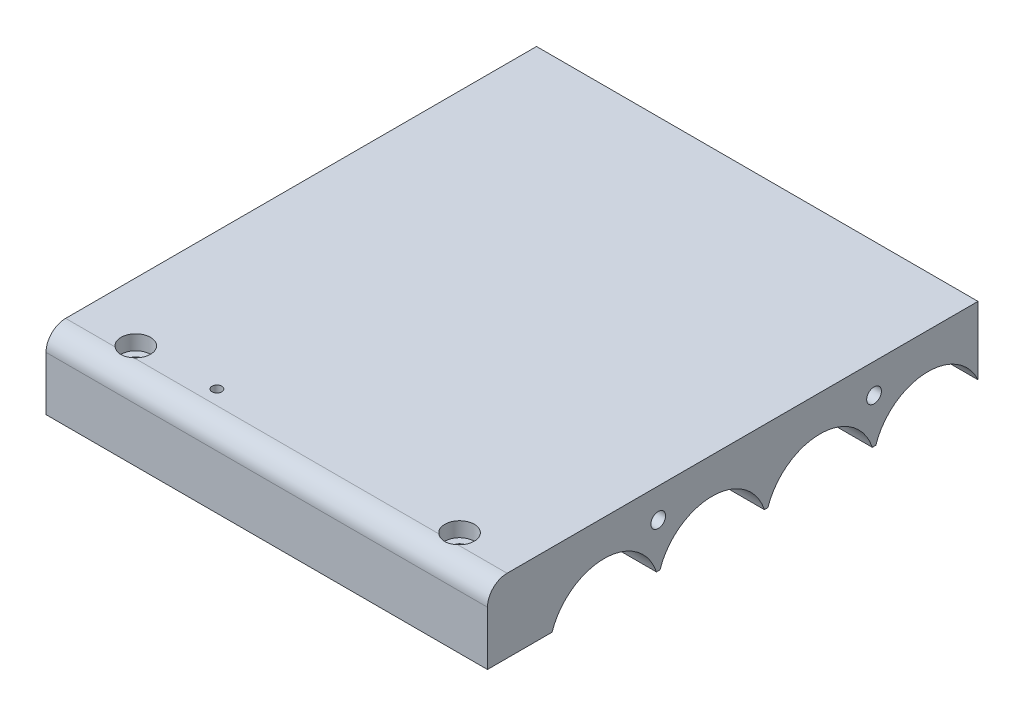
ISO-10303-21;
HEADER;
FILE_DESCRIPTION(('STEP AP214'),'2;1');
FILE_NAME('part.step','',(''),(''),'','','');
FILE_SCHEMA(('AUTOMOTIVE_DESIGN { 1 0 10303 214 1 1 1 1 }'));
ENDSEC;
DATA;
#1=APPLICATION_CONTEXT('core data for automotive mechanical design processes');
#2=APPLICATION_PROTOCOL_DEFINITION('international standard','automotive_design',2000,#1);
#3=PRODUCT_CONTEXT('',#1,'mechanical');
#4=PRODUCT('Part','Part','',(#3));
#5=PRODUCT_RELATED_PRODUCT_CATEGORY('part','',(#4));
#6=PRODUCT_DEFINITION_FORMATION('','',#4);
#7=PRODUCT_DEFINITION_CONTEXT('part definition',#1,'design');
#8=PRODUCT_DEFINITION('design','',#6,#7);
#9=PRODUCT_DEFINITION_SHAPE('','',#8);
#10=(LENGTH_UNIT() NAMED_UNIT(*) SI_UNIT(.MILLI.,.METRE.));
#11=(NAMED_UNIT(*) PLANE_ANGLE_UNIT() SI_UNIT($,.RADIAN.));
#12=(NAMED_UNIT(*) SI_UNIT($,.STERADIAN.) SOLID_ANGLE_UNIT());
#13=UNCERTAINTY_MEASURE_WITH_UNIT(LENGTH_MEASURE(1.E-05),#10,'distance_accuracy_value','');
#14=(GEOMETRIC_REPRESENTATION_CONTEXT(3) GLOBAL_UNCERTAINTY_ASSIGNED_CONTEXT((#13)) GLOBAL_UNIT_ASSIGNED_CONTEXT((#10,
#11,#12)) REPRESENTATION_CONTEXT('',''));
#15=CARTESIAN_POINT('',(0.,0.,0.));
#16=DIRECTION('',(0.,0.,1.));
#17=DIRECTION('',(1.,0.,0.));
#18=AXIS2_PLACEMENT_3D('',#15,#16,#17);
#19=CARTESIAN_POINT('',(58.,-10.001,-6.30500000000006));
#20=DIRECTION('',(0.,1.,0.));
#21=DIRECTION('',(0.,0.,1.));
#22=AXIS2_PLACEMENT_3D('',#19,#20,#21);
#23=CYLINDRICAL_SURFACE('',#22,1.5);
#24=CARTESIAN_POINT('',(58.,-10.,-6.30500000000006));
#25=DIRECTION('',(0.,-1.,0.));
#26=DIRECTION('',(0.,0.,-1.));
#27=AXIS2_PLACEMENT_3D('',#24,#25,#26);
#28=CIRCLE('',#27,1.5);
#29=CARTESIAN_POINT('',(58.,-10.,-7.80500000000006));
#30=VERTEX_POINT('',#29);
#31=EDGE_CURVE('E390',#30,#30,#28,.F.);
#32=ORIENTED_EDGE('',*,*,#31,.F.);
#33=EDGE_LOOP('',(#32));
#34=FACE_BOUND('',#33,.T.);
#35=CARTESIAN_POINT('',(58.,2.,-6.30500000000006));
#36=DIRECTION('',(0.,1.,0.));
#37=DIRECTION('',(0.,0.,1.));
#38=AXIS2_PLACEMENT_3D('',#35,#36,#37);
#39=CIRCLE('',#38,1.5);
#40=CARTESIAN_POINT('',(58.,2.,-4.80500000000005));
#41=VERTEX_POINT('',#40);
#42=EDGE_CURVE('E385',#41,#41,#39,.F.);
#43=ORIENTED_EDGE('',*,*,#42,.F.);
#44=EDGE_LOOP('',(#43));
#45=FACE_BOUND('',#44,.T.);
#46=ADVANCED_FACE('F63',(#34,#45),#23,.F.);
#47=CARTESIAN_POINT('',(-8.,-10.001,-6.30500000000006));
#48=DIRECTION('',(0.,1.,0.));
#49=DIRECTION('',(0.,0.,1.));
#50=AXIS2_PLACEMENT_3D('',#47,#48,#49);
#51=CYLINDRICAL_SURFACE('',#50,1.5);
#52=CARTESIAN_POINT('',(-8.,-10.,-6.30500000000006));
#53=DIRECTION('',(0.,-1.,0.));
#54=DIRECTION('',(0.,0.,-1.));
#55=AXIS2_PLACEMENT_3D('',#52,#53,#54);
#56=CIRCLE('',#55,1.5);
#57=CARTESIAN_POINT('',(-8.,-10.,-7.80500000000006));
#58=VERTEX_POINT('',#57);
#59=EDGE_CURVE('E590',#58,#58,#56,.F.);
#60=ORIENTED_EDGE('',*,*,#59,.F.);
#61=EDGE_LOOP('',(#60));
#62=FACE_BOUND('',#61,.T.);
#63=CARTESIAN_POINT('',(-8.,2.,-6.30500000000006));
#64=DIRECTION('',(0.,1.,0.));
#65=DIRECTION('',(0.,0.,1.));
#66=AXIS2_PLACEMENT_3D('',#63,#64,#65);
#67=CIRCLE('',#66,1.5);
#68=CARTESIAN_POINT('',(-8.,2.,-4.80500000000006));
#69=VERTEX_POINT('',#68);
#70=EDGE_CURVE('E381',#69,#69,#67,.F.);
#71=ORIENTED_EDGE('',*,*,#70,.F.);
#72=EDGE_LOOP('',(#71));
#73=FACE_BOUND('',#72,.T.);
#74=ADVANCED_FACE('F432',(#62,#73),#51,.F.);
#75=CARTESIAN_POINT('',(0.,5.,0.));
#76=DIRECTION('',(1.,0.,0.));
#77=DIRECTION('',(0.,0.,-1.));
#78=AXIS2_PLACEMENT_3D('',#75,#76,#77);
#79=PLANE('',#78);
#80=DIRECTION('',(0.,-1.,0.));
#81=VECTOR('',#80,1.);
#82=CARTESIAN_POINT('',(0.,-2.29998203945247,-12.6100000000001));
#83=LINE('',#82,#81);
#84=CARTESIAN_POINT('',(0.,-2.29998203945247,-12.6100000000001));
#85=VERTEX_POINT('',#84);
#86=CARTESIAN_POINT('',(0.,-10.,-12.6100000000001));
#87=VERTEX_POINT('',#86);
#88=EDGE_CURVE('E244',#85,#87,#83,.T.);
#89=ORIENTED_EDGE('',*,*,#88,.F.);
#90=DIRECTION('',(0.,0.,1.));
#91=VECTOR('',#90,1.);
#92=CARTESIAN_POINT('',(0.,-2.29998203945247,-12.6100000000001));
#93=LINE('',#92,#91);
#94=CARTESIAN_POINT('',(0.,-2.29998203945247,-23.8100000000001));
#95=VERTEX_POINT('',#94);
#96=EDGE_CURVE('E247',#95,#85,#93,.T.);
#97=ORIENTED_EDGE('',*,*,#96,.F.);
#98=CARTESIAN_POINT('',(0.,-13.4999820394525,-23.8100000000001));
#99=DIRECTION('',(-1.,0.,0.));
#100=DIRECTION('',(0.,0.,1.));
#101=AXIS2_PLACEMENT_3D('',#98,#99,#100);
#102=CIRCLE('',#101,11.2);
#103=CARTESIAN_POINT('',(0.,-10.,-13.1709151839311));
#104=VERTEX_POINT('',#103);
#105=EDGE_CURVE('E328',#104,#95,#102,.T.);
#106=ORIENTED_EDGE('',*,*,#105,.F.);
#107=DIRECTION('',(0.,0.,1.));
#108=VECTOR('',#107,1.);
#109=CARTESIAN_POINT('',(0.,-10.,0.));
#110=LINE('',#109,#108);
#111=EDGE_CURVE('E345',#104,#87,#110,.T.);
#112=ORIENTED_EDGE('',*,*,#111,.T.);
#113=EDGE_LOOP('',(#89,#97,#106,#112));
#114=FACE_BOUND('',#113,.T.);
#115=ADVANCED_FACE('F435',(#114),#79,.F.);
#116=CARTESIAN_POINT('',(0.,-2.29998203945247,-100.));
#117=VERTEX_POINT('',#116);
#118=CARTESIAN_POINT('',(0.,-2.29998203945247,-89.8100000000001));
#119=VERTEX_POINT('',#118);
#120=EDGE_CURVE('E240',#117,#119,#93,.T.);
#121=ORIENTED_EDGE('',*,*,#120,.F.);
#122=DIRECTION('',(0.,1.,0.));
#123=VECTOR('',#122,1.);
#124=CARTESIAN_POINT('',(0.,5.,-100.));
#125=LINE('',#124,#123);
#126=CARTESIAN_POINT('',(0.,-8.8519824697448,-100.));
#127=VERTEX_POINT('',#126);
#128=EDGE_CURVE('E217',#127,#117,#125,.T.);
#129=ORIENTED_EDGE('',*,*,#128,.F.);
#130=CARTESIAN_POINT('',(0.,-13.4999820394525,-89.8100000000001));
#131=DIRECTION('',(-1.,0.,0.));
#132=DIRECTION('',(0.,0.,1.));
#133=AXIS2_PLACEMENT_3D('',#130,#131,#132);
#134=CIRCLE('',#133,11.2);
#135=EDGE_CURVE('E285',#119,#127,#134,.T.);
#136=ORIENTED_EDGE('',*,*,#135,.F.);
#137=EDGE_LOOP('',(#121,#129,#136));
#138=FACE_BOUND('',#137,.T.);
#139=ADVANCED_FACE('F529',(#138),#79,.F.);
#140=CARTESIAN_POINT('',(0.,-2.29998203945247,-67.8100000000001));
#141=VERTEX_POINT('',#140);
#142=EDGE_CURVE('E246',#119,#141,#93,.T.);
#143=ORIENTED_EDGE('',*,*,#142,.F.);
#144=CARTESIAN_POINT('',(0.,-10.,-79.1709151839311));
#145=VERTEX_POINT('',#144);
#146=EDGE_CURVE('E286',#145,#119,#134,.T.);
#147=ORIENTED_EDGE('',*,*,#146,.F.);
#148=DIRECTION('',(0.,0.,1.));
#149=VECTOR('',#148,1.);
#150=CARTESIAN_POINT('',(0.,-10.,0.));
#151=LINE('',#150,#149);
#152=CARTESIAN_POINT('',(0.,-10.,-78.4490848160691));
#153=VERTEX_POINT('',#152);
#154=EDGE_CURVE('E350',#145,#153,#151,.T.);
#155=ORIENTED_EDGE('',*,*,#154,.T.);
#156=CARTESIAN_POINT('',(0.,-13.4999820394525,-67.8100000000001));
#157=DIRECTION('',(-1.,0.,0.));
#158=DIRECTION('',(0.,0.,1.));
#159=AXIS2_PLACEMENT_3D('',#156,#157,#158);
#160=CIRCLE('',#159,11.2);
#161=EDGE_CURVE('E296',#141,#153,#160,.T.);
#162=ORIENTED_EDGE('',*,*,#161,.F.);
#163=EDGE_LOOP('',(#143,#147,#155,#162));
#164=FACE_BOUND('',#163,.T.);
#165=ADVANCED_FACE('F533',(#164),#79,.F.);
#166=CARTESIAN_POINT('',(0.,-2.29998203945247,-45.8100000000001));
#167=VERTEX_POINT('',#166);
#168=EDGE_CURVE('E550',#141,#167,#93,.T.);
#169=ORIENTED_EDGE('',*,*,#168,.F.);
#170=CARTESIAN_POINT('',(0.,-10.,-57.1709151839311));
#171=VERTEX_POINT('',#170);
#172=EDGE_CURVE('E298',#171,#141,#160,.T.);
#173=ORIENTED_EDGE('',*,*,#172,.F.);
#174=DIRECTION('',(0.,0.,1.));
#175=VECTOR('',#174,1.);
#176=CARTESIAN_POINT('',(0.,-10.,0.));
#177=LINE('',#176,#175);
#178=CARTESIAN_POINT('',(0.,-10.,-56.4490848160691));
#179=VERTEX_POINT('',#178);
#180=EDGE_CURVE('E358',#171,#179,#177,.T.);
#181=ORIENTED_EDGE('',*,*,#180,.T.);
#182=CARTESIAN_POINT('',(0.,-13.4999820394525,-45.8100000000001));
#183=DIRECTION('',(-1.,0.,0.));
#184=DIRECTION('',(0.,0.,1.));
#185=AXIS2_PLACEMENT_3D('',#182,#183,#184);
#186=CIRCLE('',#185,11.2);
#187=EDGE_CURVE('E312',#167,#179,#186,.T.);
#188=ORIENTED_EDGE('',*,*,#187,.F.);
#189=EDGE_LOOP('',(#169,#173,#181,#188));
#190=FACE_BOUND('',#189,.T.);
#191=ADVANCED_FACE('F536',(#190),#79,.F.);
#192=EDGE_CURVE('E544',#167,#95,#93,.T.);
#193=ORIENTED_EDGE('',*,*,#192,.F.);
#194=CARTESIAN_POINT('',(0.,-10.,-35.1709151839311));
#195=VERTEX_POINT('',#194);
#196=EDGE_CURVE('E314',#195,#167,#186,.T.);
#197=ORIENTED_EDGE('',*,*,#196,.F.);
#198=DIRECTION('',(0.,0.,1.));
#199=VECTOR('',#198,1.);
#200=CARTESIAN_POINT('',(0.,-10.,0.));
#201=LINE('',#200,#199);
#202=CARTESIAN_POINT('',(0.,-10.,-34.4490848160691));
#203=VERTEX_POINT('',#202);
#204=EDGE_CURVE('E366',#195,#203,#201,.T.);
#205=ORIENTED_EDGE('',*,*,#204,.T.);
#206=EDGE_CURVE('E327',#95,#203,#102,.T.);
#207=ORIENTED_EDGE('',*,*,#206,.F.);
#208=EDGE_LOOP('',(#193,#197,#205,#207));
#209=FACE_BOUND('',#208,.T.);
#210=ADVANCED_FACE('F525',(#209),#79,.F.);
#211=CARTESIAN_POINT('',(70.,5.,0.));
#212=DIRECTION('',(-1.,0.,0.));
#213=DIRECTION('',(0.,0.,1.));
#214=AXIS2_PLACEMENT_3D('',#211,#212,#213);
#215=PLANE('',#214);
#216=CARTESIAN_POINT('',(70.,-1.00000000000001,-78.8100089802816));
#217=DIRECTION('',(1.,0.,0.));
#218=DIRECTION('',(0.,0.,-1.));
#219=AXIS2_PLACEMENT_3D('',#216,#217,#218);
#220=CIRCLE('',#219,1.5);
#221=CARTESIAN_POINT('',(70.,-1.00000000000001,-80.3100089802816));
#222=VERTEX_POINT('',#221);
#223=EDGE_CURVE('E266',#222,#222,#220,.T.);
#224=ORIENTED_EDGE('',*,*,#223,.F.);
#225=EDGE_LOOP('',(#224));
#226=FACE_BOUND('',#225,.T.);
#227=CARTESIAN_POINT('',(70.,-0.99999999999999,-34.8100089802816));
#228=DIRECTION('',(1.,0.,0.));
#229=DIRECTION('',(0.,0.,-1.));
#230=AXIS2_PLACEMENT_3D('',#227,#228,#229);
#231=CIRCLE('',#230,1.5);
#232=CARTESIAN_POINT('',(70.,-0.99999999999999,-36.3100089802816));
#233=VERTEX_POINT('',#232);
#234=EDGE_CURVE('E260',#233,#233,#231,.T.);
#235=ORIENTED_EDGE('',*,*,#234,.F.);
#236=EDGE_LOOP('',(#235));
#237=FACE_BOUND('',#236,.T.);
#238=DIRECTION('',(0.,0.,-1.));
#239=VECTOR('',#238,1.);
#240=CARTESIAN_POINT('',(70.,5.,0.));
#241=LINE('',#240,#239);
#242=CARTESIAN_POINT('',(70.,5.,-4.));
#243=VERTEX_POINT('',#242);
#244=CARTESIAN_POINT('',(70.,5.,-100.));
#245=VERTEX_POINT('',#244);
#246=EDGE_CURVE('E211',#243,#245,#241,.T.);
#247=ORIENTED_EDGE('',*,*,#246,.F.);
#248=CARTESIAN_POINT('',(70.,1.,-4.));
#249=DIRECTION('',(-1.,0.,0.));
#250=DIRECTION('',(0.,0.,1.));
#251=AXIS2_PLACEMENT_3D('',#248,#249,#250);
#252=CIRCLE('',#251,4.);
#253=CARTESIAN_POINT('',(70.,1.,0.));
#254=VERTEX_POINT('',#253);
#255=EDGE_CURVE('E87',#243,#254,#252,.F.);
#256=ORIENTED_EDGE('',*,*,#255,.T.);
#257=DIRECTION('',(0.,-1.,0.));
#258=VECTOR('',#257,1.);
#259=CARTESIAN_POINT('',(70.,5.,0.));
#260=LINE('',#259,#258);
#261=CARTESIAN_POINT('',(70.,-10.,0.));
#262=VERTEX_POINT('',#261);
#263=EDGE_CURVE('E378',#254,#262,#260,.T.);
#264=ORIENTED_EDGE('',*,*,#263,.T.);
#265=DIRECTION('',(0.,0.,-1.));
#266=VECTOR('',#265,1.);
#267=CARTESIAN_POINT('',(70.,-10.,0.));
#268=LINE('',#267,#266);
#269=CARTESIAN_POINT('',(70.,-10.,-13.1709151839311));
#270=VERTEX_POINT('',#269);
#271=EDGE_CURVE('E370',#262,#270,#268,.T.);
#272=ORIENTED_EDGE('',*,*,#271,.T.);
#273=CARTESIAN_POINT('',(70.,-13.4999820394525,-23.8100000000001));
#274=DIRECTION('',(-1.,0.,0.));
#275=DIRECTION('',(0.,0.,1.));
#276=AXIS2_PLACEMENT_3D('',#273,#274,#275);
#277=CIRCLE('',#276,11.2);
#278=CARTESIAN_POINT('',(70.,-10.,-34.4490848160691));
#279=VERTEX_POINT('',#278);
#280=EDGE_CURVE('E265',#279,#270,#277,.F.);
#281=ORIENTED_EDGE('',*,*,#280,.F.);
#282=DIRECTION('',(0.,0.,-1.));
#283=VECTOR('',#282,1.);
#284=CARTESIAN_POINT('',(70.,-10.,0.));
#285=LINE('',#284,#283);
#286=CARTESIAN_POINT('',(70.,-10.,-35.1709151839311));
#287=VERTEX_POINT('',#286);
#288=EDGE_CURVE('E362',#279,#287,#285,.T.);
#289=ORIENTED_EDGE('',*,*,#288,.T.);
#290=CARTESIAN_POINT('',(70.,-13.4999820394525,-45.8100000000001));
#291=DIRECTION('',(-1.,0.,0.));
#292=DIRECTION('',(0.,0.,1.));
#293=AXIS2_PLACEMENT_3D('',#290,#291,#292);
#294=CIRCLE('',#293,11.2);
#295=CARTESIAN_POINT('',(70.,-10.,-56.4490848160691));
#296=VERTEX_POINT('',#295);
#297=EDGE_CURVE('E309',#296,#287,#294,.F.);
#298=ORIENTED_EDGE('',*,*,#297,.F.);
#299=DIRECTION('',(0.,0.,-1.));
#300=VECTOR('',#299,1.);
#301=CARTESIAN_POINT('',(70.,-10.,0.));
#302=LINE('',#301,#300);
#303=CARTESIAN_POINT('',(70.,-10.,-57.1709151839311));
#304=VERTEX_POINT('',#303);
#305=EDGE_CURVE('E354',#296,#304,#302,.T.);
#306=ORIENTED_EDGE('',*,*,#305,.T.);
#307=CARTESIAN_POINT('',(70.,-13.4999820394525,-67.8100000000001));
#308=DIRECTION('',(-1.,0.,0.));
#309=DIRECTION('',(0.,0.,1.));
#310=AXIS2_PLACEMENT_3D('',#307,#308,#309);
#311=CIRCLE('',#310,11.2);
#312=CARTESIAN_POINT('',(70.,-10.,-78.4490848160691));
#313=VERTEX_POINT('',#312);
#314=EDGE_CURVE('E293',#313,#304,#311,.F.);
#315=ORIENTED_EDGE('',*,*,#314,.F.);
#316=DIRECTION('',(0.,0.,-1.));
#317=VECTOR('',#316,1.);
#318=CARTESIAN_POINT('',(70.,-10.,0.));
#319=LINE('',#318,#317);
#320=CARTESIAN_POINT('',(70.,-10.,-79.1709151839311));
#321=VERTEX_POINT('',#320);
#322=EDGE_CURVE('E346',#313,#321,#319,.T.);
#323=ORIENTED_EDGE('',*,*,#322,.T.);
#324=CARTESIAN_POINT('',(70.,-13.4999820394525,-89.8100000000001));
#325=DIRECTION('',(-1.,0.,0.));
#326=DIRECTION('',(0.,0.,1.));
#327=AXIS2_PLACEMENT_3D('',#324,#325,#326);
#328=CIRCLE('',#327,11.2);
#329=CARTESIAN_POINT('',(70.,-8.8519824697448,-100.));
#330=VERTEX_POINT('',#329);
#331=EDGE_CURVE('E290',#330,#321,#328,.F.);
#332=ORIENTED_EDGE('',*,*,#331,.F.);
#333=DIRECTION('',(0.,-1.,0.));
#334=VECTOR('',#333,1.);
#335=CARTESIAN_POINT('',(70.,5.,-100.));
#336=LINE('',#335,#334);
#337=EDGE_CURVE('E216',#245,#330,#336,.T.);
#338=ORIENTED_EDGE('',*,*,#337,.F.);
#339=EDGE_LOOP('',(#247,#256,#264,#272,#281,#289,#298,#306,#315,#323,#332,#338));
#340=FACE_BOUND('',#339,.T.);
#341=ADVANCED_FACE('F522',(#226,#237,#340),#215,.F.);
#342=CARTESIAN_POINT('',(0.,5.,0.));
#343=DIRECTION('',(0.,0.,-1.));
#344=DIRECTION('',(-1.,0.,0.));
#345=AXIS2_PLACEMENT_3D('',#342,#343,#344);
#346=PLANE('',#345);
#347=ORIENTED_EDGE('',*,*,#263,.F.);
#348=DIRECTION('',(1.,0.,0.));
#349=VECTOR('',#348,1.);
#350=CARTESIAN_POINT('',(0.,1.,0.));
#351=LINE('',#350,#349);
#352=CARTESIAN_POINT('',(-20.,1.,0.));
#353=VERTEX_POINT('',#352);
#354=EDGE_CURVE('E73',#254,#353,#351,.F.);
#355=ORIENTED_EDGE('',*,*,#354,.T.);
#356=DIRECTION('',(0.,1.,0.));
#357=VECTOR('',#356,1.);
#358=CARTESIAN_POINT('',(-20.,5.,0.));
#359=LINE('',#358,#357);
#360=CARTESIAN_POINT('',(-20.,-10.,0.));
#361=VERTEX_POINT('',#360);
#362=EDGE_CURVE('E206',#361,#353,#359,.T.);
#363=ORIENTED_EDGE('',*,*,#362,.F.);
#364=DIRECTION('',(-1.,0.,0.));
#365=VECTOR('',#364,1.);
#366=CARTESIAN_POINT('',(86.2510338132687,-10.,0.));
#367=LINE('',#366,#365);
#368=EDGE_CURVE('E340',#262,#361,#367,.T.);
#369=ORIENTED_EDGE('',*,*,#368,.F.);
#370=EDGE_LOOP('',(#347,#355,#363,#369));
#371=FACE_BOUND('',#370,.T.);
#372=ADVANCED_FACE('F520',(#371),#346,.F.);
#373=CARTESIAN_POINT('',(0.,5.,0.));
#374=DIRECTION('',(0.,-1.,0.));
#375=DIRECTION('',(0.,0.,-1.));
#376=AXIS2_PLACEMENT_3D('',#373,#374,#375);
#377=PLANE('',#376);
#378=CARTESIAN_POINT('',(7.89100000000002,5.,-6.94332573446726));
#379=DIRECTION('',(0.,1.,0.));
#380=DIRECTION('',(0.,0.,1.));
#381=AXIS2_PLACEMENT_3D('',#378,#379,#380);
#382=CIRCLE('',#381,1.);
#383=CARTESIAN_POINT('',(7.89100000000002,5.,-5.94332573446726));
#384=VERTEX_POINT('',#383);
#385=EDGE_CURVE('E575',#384,#384,#382,.T.);
#386=ORIENTED_EDGE('',*,*,#385,.F.);
#387=EDGE_LOOP('',(#386));
#388=FACE_BOUND('',#387,.T.);
#389=DIRECTION('',(0.,0.,-1.));
#390=VECTOR('',#389,1.);
#391=CARTESIAN_POINT('',(-20.,5.,0.));
#392=LINE('',#391,#390);
#393=CARTESIAN_POINT('',(-20.,5.,-4.));
#394=VERTEX_POINT('',#393);
#395=CARTESIAN_POINT('',(-20.,5.,-100.));
#396=VERTEX_POINT('',#395);
#397=EDGE_CURVE('E195',#394,#396,#392,.T.);
#398=ORIENTED_EDGE('',*,*,#397,.F.);
#399=DIRECTION('',(1.,0.,0.));
#400=VECTOR('',#399,1.);
#401=CARTESIAN_POINT('',(0.,5.,-4.));
#402=LINE('',#401,#400);
#403=CARTESIAN_POINT('',(-9.92014973374467,5.,-4.));
#404=VERTEX_POINT('',#403);
#405=EDGE_CURVE('E397',#394,#404,#402,.T.);
#406=ORIENTED_EDGE('',*,*,#405,.T.);
#407=CARTESIAN_POINT('',(-8.,5.,-6.30500000000006));
#408=DIRECTION('',(0.,1.,0.));
#409=DIRECTION('',(0.,0.,1.));
#410=AXIS2_PLACEMENT_3D('',#407,#408,#409);
#411=CIRCLE('',#410,3.);
#412=CARTESIAN_POINT('',(-6.07985026625533,5.,-4.));
#413=VERTEX_POINT('',#412);
#414=EDGE_CURVE('E559',#413,#404,#411,.T.);
#415=ORIENTED_EDGE('',*,*,#414,.F.);
#416=DIRECTION('',(1.,0.,0.));
#417=VECTOR('',#416,1.);
#418=CARTESIAN_POINT('',(0.,5.,-4.));
#419=LINE('',#418,#417);
#420=CARTESIAN_POINT('',(56.0798502662553,5.,-4.));
#421=VERTEX_POINT('',#420);
#422=EDGE_CURVE('E394',#413,#421,#419,.T.);
#423=ORIENTED_EDGE('',*,*,#422,.T.);
#424=CARTESIAN_POINT('',(58.,5.,-6.30500000000006));
#425=DIRECTION('',(0.,1.,0.));
#426=DIRECTION('',(0.,0.,1.));
#427=AXIS2_PLACEMENT_3D('',#424,#425,#426);
#428=CIRCLE('',#427,3.);
#429=CARTESIAN_POINT('',(59.9201497337447,5.,-4.));
#430=VERTEX_POINT('',#429);
#431=EDGE_CURVE('E573',#430,#421,#428,.T.);
#432=ORIENTED_EDGE('',*,*,#431,.F.);
#433=DIRECTION('',(1.,0.,0.));
#434=VECTOR('',#433,1.);
#435=CARTESIAN_POINT('',(0.,5.,-4.));
#436=LINE('',#435,#434);
#437=EDGE_CURVE('E391',#430,#243,#436,.T.);
#438=ORIENTED_EDGE('',*,*,#437,.T.);
#439=ORIENTED_EDGE('',*,*,#246,.T.);
#440=DIRECTION('',(-1.,0.,0.));
#441=VECTOR('',#440,1.);
#442=CARTESIAN_POINT('',(88.0277563773199,5.,-100.));
#443=LINE('',#442,#441);
#444=EDGE_CURVE('E209',#245,#396,#443,.T.);
#445=ORIENTED_EDGE('',*,*,#444,.T.);
#446=EDGE_LOOP('',(#398,#406,#415,#423,#432,#438,#439,#445));
#447=FACE_BOUND('',#446,.T.);
#448=ADVANCED_FACE('F210',(#388,#447),#377,.F.);
#449=CARTESIAN_POINT('',(80.3701504382114,-10.,0.));
#450=DIRECTION('',(0.,-1.,0.));
#451=DIRECTION('',(0.,0.,-1.));
#452=AXIS2_PLACEMENT_3D('',#449,#450,#451);
#453=PLANE('',#452);
#454=DIRECTION('',(-1.,0.,0.));
#455=VECTOR('',#454,1.);
#456=CARTESIAN_POINT('',(70.001,-10.,-79.1709151839311));
#457=LINE('',#456,#455);
#458=EDGE_CURVE('E280',#145,#321,#457,.F.);
#459=ORIENTED_EDGE('',*,*,#458,.T.);
#460=ORIENTED_EDGE('',*,*,#322,.F.);
#461=DIRECTION('',(-1.,0.,0.));
#462=VECTOR('',#461,1.);
#463=CARTESIAN_POINT('',(70.001,-10.,-78.4490848160691));
#464=LINE('',#463,#462);
#465=EDGE_CURVE('E302',#313,#153,#464,.T.);
#466=ORIENTED_EDGE('',*,*,#465,.T.);
#467=ORIENTED_EDGE('',*,*,#154,.F.);
#468=EDGE_LOOP('',(#459,#460,#466,#467));
#469=FACE_BOUND('',#468,.T.);
#470=ADVANCED_FACE('F503',(#469),#453,.T.);
#471=CARTESIAN_POINT('',(80.3701504382114,-10.,0.));
#472=DIRECTION('',(0.,-1.,0.));
#473=DIRECTION('',(0.,0.,-1.));
#474=AXIS2_PLACEMENT_3D('',#471,#472,#473);
#475=PLANE('',#474);
#476=CARTESIAN_POINT('',(7.89100000000002,-10.,-6.94332573446726));
#477=DIRECTION('',(0.,-1.,0.));
#478=DIRECTION('',(0.,0.,-1.));
#479=AXIS2_PLACEMENT_3D('',#476,#477,#478);
#480=CIRCLE('',#479,1.);
#481=CARTESIAN_POINT('',(7.89100000000002,-10.,-7.94332573446726));
#482=VERTEX_POINT('',#481);
#483=EDGE_CURVE('E577',#482,#482,#480,.F.);
#484=ORIENTED_EDGE('',*,*,#483,.T.);
#485=EDGE_LOOP('',(#484));
#486=FACE_BOUND('',#485,.T.);
#487=ORIENTED_EDGE('',*,*,#59,.T.);
#488=EDGE_LOOP('',(#487));
#489=FACE_BOUND('',#488,.T.);
#490=ORIENTED_EDGE('',*,*,#31,.T.);
#491=EDGE_LOOP('',(#490));
#492=FACE_BOUND('',#491,.T.);
#493=DIRECTION('',(-1.,0.,0.));
#494=VECTOR('',#493,1.);
#495=CARTESIAN_POINT('',(70.001,-10.,-13.1709151839311));
#496=LINE('',#495,#494);
#497=EDGE_CURVE('E332',#104,#270,#496,.F.);
#498=ORIENTED_EDGE('',*,*,#497,.T.);
#499=ORIENTED_EDGE('',*,*,#271,.F.);
#500=ORIENTED_EDGE('',*,*,#368,.T.);
#501=DIRECTION('',(0.,0.,1.));
#502=VECTOR('',#501,1.);
#503=CARTESIAN_POINT('',(-20.,-10.,0.));
#504=LINE('',#503,#502);
#505=CARTESIAN_POINT('',(-20.,-10.,-12.6100000000001));
#506=VERTEX_POINT('',#505);
#507=EDGE_CURVE('E235',#506,#361,#504,.T.);
#508=ORIENTED_EDGE('',*,*,#507,.F.);
#509=DIRECTION('',(1.,0.,0.));
#510=VECTOR('',#509,1.);
#511=CARTESIAN_POINT('',(-20.,-10.,-12.6100000000001));
#512=LINE('',#511,#510);
#513=EDGE_CURVE('E239',#506,#87,#512,.T.);
#514=ORIENTED_EDGE('',*,*,#513,.T.);
#515=ORIENTED_EDGE('',*,*,#111,.F.);
#516=EDGE_LOOP('',(#498,#499,#500,#508,#514,#515));
#517=FACE_BOUND('',#516,.T.);
#518=ADVANCED_FACE('F506',(#486,#489,#492,#517),#475,.T.);
#519=CARTESIAN_POINT('',(80.3701504382114,-10.,0.));
#520=DIRECTION('',(0.,-1.,0.));
#521=DIRECTION('',(0.,0.,-1.));
#522=AXIS2_PLACEMENT_3D('',#519,#520,#521);
#523=PLANE('',#522);
#524=DIRECTION('',(-1.,0.,0.));
#525=VECTOR('',#524,1.);
#526=CARTESIAN_POINT('',(70.001,-10.,-35.1709151839311));
#527=LINE('',#526,#525);
#528=EDGE_CURVE('E318',#195,#287,#527,.F.);
#529=ORIENTED_EDGE('',*,*,#528,.T.);
#530=ORIENTED_EDGE('',*,*,#288,.F.);
#531=DIRECTION('',(-1.,0.,0.));
#532=VECTOR('',#531,1.);
#533=CARTESIAN_POINT('',(70.001,-10.,-34.4490848160691));
#534=LINE('',#533,#532);
#535=EDGE_CURVE('E313',#279,#203,#534,.T.);
#536=ORIENTED_EDGE('',*,*,#535,.T.);
#537=ORIENTED_EDGE('',*,*,#204,.F.);
#538=EDGE_LOOP('',(#529,#530,#536,#537));
#539=FACE_BOUND('',#538,.T.);
#540=ADVANCED_FACE('F510',(#539),#523,.T.);
#541=CARTESIAN_POINT('',(80.3701504382114,-10.,0.));
#542=DIRECTION('',(0.,-1.,0.));
#543=DIRECTION('',(0.,0.,-1.));
#544=AXIS2_PLACEMENT_3D('',#541,#542,#543);
#545=PLANE('',#544);
#546=DIRECTION('',(-1.,0.,0.));
#547=VECTOR('',#546,1.);
#548=CARTESIAN_POINT('',(70.001,-10.,-57.1709151839311));
#549=LINE('',#548,#547);
#550=EDGE_CURVE('E281',#171,#304,#549,.F.);
#551=ORIENTED_EDGE('',*,*,#550,.T.);
#552=ORIENTED_EDGE('',*,*,#305,.F.);
#553=DIRECTION('',(-1.,0.,0.));
#554=VECTOR('',#553,1.);
#555=CARTESIAN_POINT('',(70.001,-10.,-56.4490848160691));
#556=LINE('',#555,#554);
#557=EDGE_CURVE('E297',#296,#179,#556,.T.);
#558=ORIENTED_EDGE('',*,*,#557,.T.);
#559=ORIENTED_EDGE('',*,*,#180,.F.);
#560=EDGE_LOOP('',(#551,#552,#558,#559));
#561=FACE_BOUND('',#560,.T.);
#562=ADVANCED_FACE('F501',(#561),#545,.T.);
#563=CARTESIAN_POINT('',(88.0277563773199,5.,-100.));
#564=DIRECTION('',(0.,0.,1.));
#565=DIRECTION('',(1.,0.,0.));
#566=AXIS2_PLACEMENT_3D('',#563,#564,#565);
#567=PLANE('',#566);
#568=CARTESIAN_POINT('',(58.,1.35000898027336,-100.));
#569=DIRECTION('',(0.,0.,-1.));
#570=DIRECTION('',(-1.,0.,0.));
#571=AXIS2_PLACEMENT_3D('',#568,#569,#570);
#572=CIRCLE('',#571,1.5);
#573=CARTESIAN_POINT('',(56.5,1.35000898027336,-100.));
#574=VERTEX_POINT('',#573);
#575=EDGE_CURVE('E568',#574,#574,#572,.T.);
#576=ORIENTED_EDGE('',*,*,#575,.F.);
#577=EDGE_LOOP('',(#576));
#578=FACE_BOUND('',#577,.T.);
#579=CARTESIAN_POINT('',(-8.00000000000001,1.35000898027338,-100.));
#580=DIRECTION('',(0.,0.,-1.));
#581=DIRECTION('',(-1.,0.,0.));
#582=AXIS2_PLACEMENT_3D('',#579,#580,#581);
#583=CIRCLE('',#582,1.5);
#584=CARTESIAN_POINT('',(-9.50000000000001,1.35000898027338,-100.));
#585=VERTEX_POINT('',#584);
#586=EDGE_CURVE('E569',#585,#585,#583,.T.);
#587=ORIENTED_EDGE('',*,*,#586,.F.);
#588=EDGE_LOOP('',(#587));
#589=FACE_BOUND('',#588,.T.);
#590=ORIENTED_EDGE('',*,*,#337,.T.);
#591=DIRECTION('',(-1.,0.,0.));
#592=VECTOR('',#591,1.);
#593=CARTESIAN_POINT('',(70.001,-8.8519824697448,-100.));
#594=LINE('',#593,#592);
#595=EDGE_CURVE('E277',#127,#330,#594,.F.);
#596=ORIENTED_EDGE('',*,*,#595,.F.);
#597=ORIENTED_EDGE('',*,*,#128,.T.);
#598=DIRECTION('',(1.,0.,0.));
#599=VECTOR('',#598,1.);
#600=CARTESIAN_POINT('',(-20.,-2.29998203945246,-100.));
#601=LINE('',#600,#599);
#602=CARTESIAN_POINT('',(-20.,-2.29998203945246,-100.));
#603=VERTEX_POINT('',#602);
#604=EDGE_CURVE('E222',#603,#117,#601,.T.);
#605=ORIENTED_EDGE('',*,*,#604,.F.);
#606=DIRECTION('',(0.,-1.,0.));
#607=VECTOR('',#606,1.);
#608=CARTESIAN_POINT('',(-20.,5.,-100.));
#609=LINE('',#608,#607);
#610=EDGE_CURVE('E199',#396,#603,#609,.T.);
#611=ORIENTED_EDGE('',*,*,#610,.F.);
#612=ORIENTED_EDGE('',*,*,#444,.F.);
#613=EDGE_LOOP('',(#590,#596,#597,#605,#611,#612));
#614=FACE_BOUND('',#613,.T.);
#615=ADVANCED_FACE('F219',(#578,#589,#614),#567,.F.);
#616=CARTESIAN_POINT('',(70.001,-13.4999820394525,-89.8100000000001));
#617=DIRECTION('',(-1.,0.,0.));
#618=DIRECTION('',(0.,0.,1.));
#619=AXIS2_PLACEMENT_3D('',#616,#617,#618);
#620=CYLINDRICAL_SURFACE('',#619,11.2);
#621=ORIENTED_EDGE('',*,*,#146,.T.);
#622=ORIENTED_EDGE('',*,*,#135,.T.);
#623=ORIENTED_EDGE('',*,*,#595,.T.);
#624=ORIENTED_EDGE('',*,*,#331,.T.);
#625=ORIENTED_EDGE('',*,*,#458,.F.);
#626=EDGE_LOOP('',(#621,#622,#623,#624,#625));
#627=FACE_BOUND('',#626,.T.);
#628=ADVANCED_FACE('F484',(#627),#620,.F.);
#629=CARTESIAN_POINT('',(70.001,-13.4999820394525,-45.8100000000001));
#630=DIRECTION('',(-1.,0.,0.));
#631=DIRECTION('',(0.,0.,1.));
#632=AXIS2_PLACEMENT_3D('',#629,#630,#631);
#633=CYLINDRICAL_SURFACE('',#632,11.2);
#634=ORIENTED_EDGE('',*,*,#196,.T.);
#635=ORIENTED_EDGE('',*,*,#187,.T.);
#636=ORIENTED_EDGE('',*,*,#557,.F.);
#637=ORIENTED_EDGE('',*,*,#297,.T.);
#638=ORIENTED_EDGE('',*,*,#528,.F.);
#639=EDGE_LOOP('',(#634,#635,#636,#637,#638));
#640=FACE_BOUND('',#639,.T.);
#641=ADVANCED_FACE('F487',(#640),#633,.F.);
#642=CARTESIAN_POINT('',(70.001,-13.4999820394525,-67.8100000000001));
#643=DIRECTION('',(-1.,0.,0.));
#644=DIRECTION('',(0.,0.,1.));
#645=AXIS2_PLACEMENT_3D('',#642,#643,#644);
#646=CYLINDRICAL_SURFACE('',#645,11.2);
#647=ORIENTED_EDGE('',*,*,#314,.T.);
#648=ORIENTED_EDGE('',*,*,#550,.F.);
#649=ORIENTED_EDGE('',*,*,#172,.T.);
#650=ORIENTED_EDGE('',*,*,#161,.T.);
#651=ORIENTED_EDGE('',*,*,#465,.F.);
#652=EDGE_LOOP('',(#647,#648,#649,#650,#651));
#653=FACE_BOUND('',#652,.T.);
#654=ADVANCED_FACE('F489',(#653),#646,.F.);
#655=CARTESIAN_POINT('',(70.001,-13.4999820394525,-23.8100000000001));
#656=DIRECTION('',(-1.,0.,0.));
#657=DIRECTION('',(0.,0.,1.));
#658=AXIS2_PLACEMENT_3D('',#655,#656,#657);
#659=CYLINDRICAL_SURFACE('',#658,11.2);
#660=ORIENTED_EDGE('',*,*,#105,.T.);
#661=ORIENTED_EDGE('',*,*,#206,.T.);
#662=ORIENTED_EDGE('',*,*,#535,.F.);
#663=ORIENTED_EDGE('',*,*,#280,.T.);
#664=ORIENTED_EDGE('',*,*,#497,.F.);
#665=EDGE_LOOP('',(#660,#661,#662,#663,#664));
#666=FACE_BOUND('',#665,.T.);
#667=ADVANCED_FACE('F482',(#666),#659,.F.);
#668=CARTESIAN_POINT('',(60.,-0.99999999999999,-34.8100089802816));
#669=DIRECTION('',(1.,0.,0.));
#670=DIRECTION('',(0.,0.,-1.));
#671=AXIS2_PLACEMENT_3D('',#668,#669,#670);
#672=CYLINDRICAL_SURFACE('',#671,1.5);
#673=CARTESIAN_POINT('',(60.,-0.99999999999999,-34.8100089802816));
#674=DIRECTION('',(1.,0.,0.));
#675=DIRECTION('',(0.,0.,-1.));
#676=AXIS2_PLACEMENT_3D('',#673,#674,#675);
#677=CIRCLE('',#676,1.5);
#678=CARTESIAN_POINT('',(60.,-0.99999999999999,-36.3100089802816));
#679=VERTEX_POINT('',#678);
#680=EDGE_CURVE('E270',#679,#679,#677,.T.);
#681=ORIENTED_EDGE('',*,*,#680,.F.);
#682=EDGE_LOOP('',(#681));
#683=FACE_BOUND('',#682,.T.);
#684=ORIENTED_EDGE('',*,*,#234,.T.);
#685=EDGE_LOOP('',(#684));
#686=FACE_BOUND('',#685,.T.);
#687=ADVANCED_FACE('F478',(#683,#686),#672,.F.);
#688=CARTESIAN_POINT('',(60.,-0.99999999999999,-34.8100089802816));
#689=DIRECTION('',(1.,0.,0.));
#690=DIRECTION('',(0.,0.,-1.));
#691=AXIS2_PLACEMENT_3D('',#688,#689,#690);
#692=PLANE('',#691);
#693=ORIENTED_EDGE('',*,*,#680,.T.);
#694=EDGE_LOOP('',(#693));
#695=FACE_BOUND('',#694,.T.);
#696=ADVANCED_FACE('F474',(#695),#692,.T.);
#697=CARTESIAN_POINT('',(60.,-1.00000000000001,-78.8100089802816));
#698=DIRECTION('',(1.,0.,0.));
#699=DIRECTION('',(0.,0.,-1.));
#700=AXIS2_PLACEMENT_3D('',#697,#698,#699);
#701=CYLINDRICAL_SURFACE('',#700,1.5);
#702=CARTESIAN_POINT('',(60.,-1.00000000000001,-78.8100089802816));
#703=DIRECTION('',(1.,0.,0.));
#704=DIRECTION('',(0.,0.,-1.));
#705=AXIS2_PLACEMENT_3D('',#702,#703,#704);
#706=CIRCLE('',#705,1.5);
#707=CARTESIAN_POINT('',(60.,-1.00000000000001,-80.3100089802816));
#708=VERTEX_POINT('',#707);
#709=EDGE_CURVE('E261',#708,#708,#706,.T.);
#710=ORIENTED_EDGE('',*,*,#709,.F.);
#711=EDGE_LOOP('',(#710));
#712=FACE_BOUND('',#711,.T.);
#713=ORIENTED_EDGE('',*,*,#223,.T.);
#714=EDGE_LOOP('',(#713));
#715=FACE_BOUND('',#714,.T.);
#716=ADVANCED_FACE('F470',(#712,#715),#701,.F.);
#717=CARTESIAN_POINT('',(60.,-1.00000000000001,-78.8100089802816));
#718=DIRECTION('',(1.,0.,0.));
#719=DIRECTION('',(0.,0.,-1.));
#720=AXIS2_PLACEMENT_3D('',#717,#718,#719);
#721=PLANE('',#720);
#722=ORIENTED_EDGE('',*,*,#709,.T.);
#723=EDGE_LOOP('',(#722));
#724=FACE_BOUND('',#723,.T.);
#725=ADVANCED_FACE('F466',(#724),#721,.T.);
#726=CARTESIAN_POINT('',(-20.,-2.29998203945247,-12.6100000000001));
#727=DIRECTION('',(0.,1.,0.));
#728=DIRECTION('',(0.,0.,1.));
#729=AXIS2_PLACEMENT_3D('',#726,#727,#728);
#730=PLANE('',#729);
#731=ORIENTED_EDGE('',*,*,#120,.T.);
#732=ORIENTED_EDGE('',*,*,#142,.T.);
#733=ORIENTED_EDGE('',*,*,#168,.T.);
#734=ORIENTED_EDGE('',*,*,#192,.T.);
#735=ORIENTED_EDGE('',*,*,#96,.T.);
#736=DIRECTION('',(1.,0.,0.));
#737=VECTOR('',#736,1.);
#738=CARTESIAN_POINT('',(-20.,-2.29998203945247,-12.6100000000001));
#739=LINE('',#738,#737);
#740=CARTESIAN_POINT('',(-20.,-2.29998203945247,-12.6100000000001));
#741=VERTEX_POINT('',#740);
#742=EDGE_CURVE('E254',#741,#85,#739,.T.);
#743=ORIENTED_EDGE('',*,*,#742,.F.);
#744=DIRECTION('',(0.,0.,1.));
#745=VECTOR('',#744,1.);
#746=CARTESIAN_POINT('',(-20.,-2.29998203945247,-12.6100000000001));
#747=LINE('',#746,#745);
#748=EDGE_CURVE('E225',#603,#741,#747,.T.);
#749=ORIENTED_EDGE('',*,*,#748,.F.);
#750=ORIENTED_EDGE('',*,*,#604,.T.);
#751=EDGE_LOOP('',(#731,#732,#733,#734,#735,#743,#749,#750));
#752=FACE_BOUND('',#751,.T.);
#753=ADVANCED_FACE('F462',(#752),#730,.F.);
#754=CARTESIAN_POINT('',(-20.,-2.29998203945247,-12.6100000000001));
#755=DIRECTION('',(0.,0.,1.));
#756=DIRECTION('',(0.,-1.,0.));
#757=AXIS2_PLACEMENT_3D('',#754,#755,#756);
#758=PLANE('',#757);
#759=ORIENTED_EDGE('',*,*,#88,.T.);
#760=ORIENTED_EDGE('',*,*,#513,.F.);
#761=DIRECTION('',(0.,-1.,0.));
#762=VECTOR('',#761,1.);
#763=CARTESIAN_POINT('',(-20.,-2.29998203945247,-12.6100000000001));
#764=LINE('',#763,#762);
#765=EDGE_CURVE('E230',#741,#506,#764,.T.);
#766=ORIENTED_EDGE('',*,*,#765,.F.);
#767=ORIENTED_EDGE('',*,*,#742,.T.);
#768=EDGE_LOOP('',(#759,#760,#766,#767));
#769=FACE_BOUND('',#768,.T.);
#770=ADVANCED_FACE('F458',(#769),#758,.F.);
#771=CARTESIAN_POINT('',(-20.,0.,0.));
#772=DIRECTION('',(1.,0.,0.));
#773=DIRECTION('',(0.,0.,-1.));
#774=AXIS2_PLACEMENT_3D('',#771,#772,#773);
#775=PLANE('',#774);
#776=CARTESIAN_POINT('',(-20.,1.35000898027377,-55.));
#777=DIRECTION('',(-1.,0.,0.));
#778=DIRECTION('',(0.,0.,1.));
#779=AXIS2_PLACEMENT_3D('',#776,#777,#778);
#780=CIRCLE('',#779,1.5);
#781=CARTESIAN_POINT('',(-20.,1.35000898027377,-53.5));
#782=VERTEX_POINT('',#781);
#783=EDGE_CURVE('E621',#782,#782,#780,.T.);
#784=ORIENTED_EDGE('',*,*,#783,.F.);
#785=EDGE_LOOP('',(#784));
#786=FACE_BOUND('',#785,.T.);
#787=ORIENTED_EDGE('',*,*,#362,.T.);
#788=CARTESIAN_POINT('',(-20.,1.,-4.));
#789=DIRECTION('',(1.,0.,0.));
#790=DIRECTION('',(0.,0.,-1.));
#791=AXIS2_PLACEMENT_3D('',#788,#789,#790);
#792=CIRCLE('',#791,4.);
#793=EDGE_CURVE('E12',#353,#394,#792,.F.);
#794=ORIENTED_EDGE('',*,*,#793,.T.);
#795=ORIENTED_EDGE('',*,*,#397,.T.);
#796=ORIENTED_EDGE('',*,*,#610,.T.);
#797=ORIENTED_EDGE('',*,*,#748,.T.);
#798=ORIENTED_EDGE('',*,*,#765,.T.);
#799=ORIENTED_EDGE('',*,*,#507,.T.);
#800=EDGE_LOOP('',(#787,#794,#795,#796,#797,#798,#799));
#801=FACE_BOUND('',#800,.T.);
#802=ADVANCED_FACE('F197',(#786,#801),#775,.F.);
#803=CARTESIAN_POINT('',(-8.00000000000001,1.35000898027338,-90.));
#804=DIRECTION('',(0.,0.,-1.));
#805=DIRECTION('',(-1.,0.,0.));
#806=AXIS2_PLACEMENT_3D('',#803,#804,#805);
#807=CYLINDRICAL_SURFACE('',#806,1.5);
#808=CARTESIAN_POINT('',(-8.00000000000001,1.35000898027338,-90.));
#809=DIRECTION('',(0.,0.,-1.));
#810=DIRECTION('',(-1.,0.,0.));
#811=AXIS2_PLACEMENT_3D('',#808,#809,#810);
#812=CIRCLE('',#811,1.5);
#813=CARTESIAN_POINT('',(-9.50000000000001,1.35000898027338,-90.));
#814=VERTEX_POINT('',#813);
#815=EDGE_CURVE('E565',#814,#814,#812,.T.);
#816=ORIENTED_EDGE('',*,*,#815,.F.);
#817=EDGE_LOOP('',(#816));
#818=FACE_BOUND('',#817,.T.);
#819=ORIENTED_EDGE('',*,*,#586,.T.);
#820=EDGE_LOOP('',(#819));
#821=FACE_BOUND('',#820,.T.);
#822=ADVANCED_FACE('F451',(#818,#821),#807,.F.);
#823=CARTESIAN_POINT('',(0.,0.,-90.));
#824=DIRECTION('',(0.,0.,-1.));
#825=DIRECTION('',(-1.,0.,0.));
#826=AXIS2_PLACEMENT_3D('',#823,#824,#825);
#827=PLANE('',#826);
#828=ORIENTED_EDGE('',*,*,#815,.T.);
#829=EDGE_LOOP('',(#828));
#830=FACE_BOUND('',#829,.T.);
#831=ADVANCED_FACE('F447',(#830),#827,.T.);
#832=CARTESIAN_POINT('',(58.,1.35000898027336,-90.));
#833=DIRECTION('',(0.,0.,-1.));
#834=DIRECTION('',(-1.,0.,0.));
#835=AXIS2_PLACEMENT_3D('',#832,#833,#834);
#836=CYLINDRICAL_SURFACE('',#835,1.5);
#837=CARTESIAN_POINT('',(58.,1.35000898027336,-90.));
#838=DIRECTION('',(0.,0.,-1.));
#839=DIRECTION('',(-1.,0.,0.));
#840=AXIS2_PLACEMENT_3D('',#837,#838,#839);
#841=CIRCLE('',#840,1.5);
#842=CARTESIAN_POINT('',(56.5,1.35000898027336,-90.));
#843=VERTEX_POINT('',#842);
#844=EDGE_CURVE('E245',#843,#843,#841,.T.);
#845=ORIENTED_EDGE('',*,*,#844,.F.);
#846=EDGE_LOOP('',(#845));
#847=FACE_BOUND('',#846,.T.);
#848=ORIENTED_EDGE('',*,*,#575,.T.);
#849=EDGE_LOOP('',(#848));
#850=FACE_BOUND('',#849,.T.);
#851=ADVANCED_FACE('F443',(#847,#850),#836,.F.);
#852=CARTESIAN_POINT('',(0.,0.,-90.));
#853=DIRECTION('',(0.,0.,-1.));
#854=DIRECTION('',(-1.,0.,0.));
#855=AXIS2_PLACEMENT_3D('',#852,#853,#854);
#856=PLANE('',#855);
#857=ORIENTED_EDGE('',*,*,#844,.T.);
#858=EDGE_LOOP('',(#857));
#859=FACE_BOUND('',#858,.T.);
#860=ADVANCED_FACE('F440',(#859),#856,.T.);
#861=CARTESIAN_POINT('',(-8.,2.,-6.30500000000006));
#862=DIRECTION('',(0.,1.,0.));
#863=DIRECTION('',(0.,0.,1.));
#864=AXIS2_PLACEMENT_3D('',#861,#862,#863);
#865=PLANE('',#864);
#866=CARTESIAN_POINT('',(-8.,2.,-6.30500000000006));
#867=DIRECTION('',(0.,1.,0.));
#868=DIRECTION('',(0.,0.,1.));
#869=AXIS2_PLACEMENT_3D('',#866,#867,#868);
#870=CIRCLE('',#869,3.);
#871=CARTESIAN_POINT('',(-8.,2.,-3.30500000000006));
#872=VERTEX_POINT('',#871);
#873=EDGE_CURVE('E386',#872,#872,#870,.T.);
#874=ORIENTED_EDGE('',*,*,#873,.T.);
#875=EDGE_LOOP('',(#874));
#876=FACE_BOUND('',#875,.T.);
#877=ORIENTED_EDGE('',*,*,#70,.T.);
#878=EDGE_LOOP('',(#877));
#879=FACE_BOUND('',#878,.T.);
#880=ADVANCED_FACE('F421',(#876,#879),#865,.T.);
#881=CARTESIAN_POINT('',(-8.,2.,-6.30500000000006));
#882=DIRECTION('',(0.,1.,0.));
#883=DIRECTION('',(0.,0.,1.));
#884=AXIS2_PLACEMENT_3D('',#881,#882,#883);
#885=CYLINDRICAL_SURFACE('',#884,3.);
#886=ORIENTED_EDGE('',*,*,#873,.F.);
#887=EDGE_LOOP('',(#886));
#888=FACE_BOUND('',#887,.T.);
#889=ORIENTED_EDGE('',*,*,#414,.T.);
#890=CARTESIAN_POINT('',(-9.92014973374467,5.,-4.));
#891=CARTESIAN_POINT('',(-9.85553794943448,4.9999948425154,-3.94616514495204));
#892=CARTESIAN_POINT('',(-9.78866576518243,4.99891298897704,-3.89507160690726));
#893=CARTESIAN_POINT('',(-9.65091562385414,4.9952239580844,-3.79870221083523));
#894=CARTESIAN_POINT('',(-9.58003868619325,4.99261716733876,-3.75342488180472));
#895=CARTESIAN_POINT('',(-9.43477194568836,4.98650615986479,-3.66900180749852));
#896=CARTESIAN_POINT('',(-9.36038268287105,4.98300208073216,-3.62985512359413));
#897=CARTESIAN_POINT('',(-9.20861688418941,4.97566193410223,-3.55794594743611));
#898=CARTESIAN_POINT('',(-9.13124021297627,4.97182585155323,-3.52518374484816));
#899=CARTESIAN_POINT('',(-8.89538896774064,4.96060918733899,-3.43682965009088));
#900=CARTESIAN_POINT('',(-8.73306714711733,4.95351312573055,-3.39109719023413));
#901=CARTESIAN_POINT('',(-8.40312600009761,4.94318944866106,-3.32746282422141));
#902=CARTESIAN_POINT('',(-8.23551048665112,4.93995911119671,-3.30954133266369));
#903=CARTESIAN_POINT('',(-7.90007960284124,4.93862941835454,-3.30199089290461));
#904=CARTESIAN_POINT('',(-7.73226616896257,4.9405154418782,-3.31228132397796));
#905=CARTESIAN_POINT('',(-7.4006578316911,4.9486558691256,-3.36070096974584));
#906=CARTESIAN_POINT('',(-7.23686708612917,4.95491461075473,-3.39885783072051));
#907=CARTESIAN_POINT('',(-6.91842245878761,4.96918528847181,-3.50176012339723));
#908=CARTESIAN_POINT('',(-6.76374779022154,4.97719302315504,-3.5664421580123));
#909=CARTESIAN_POINT('',(-6.46750992662265,4.99097278506317,-3.72058248040137));
#910=CARTESIAN_POINT('',(-6.32591426801456,4.99675046752204,-3.80997709663986));
#911=CARTESIAN_POINT('',(-6.15444009251213,4.99964404461968,-3.93936092892808));
#912=CARTESIAN_POINT('',(-6.11676558462919,4.99999800332919,-3.96923857905116));
#913=CARTESIAN_POINT('',(-6.07985026625533,5.,-4.));
#914=B_SPLINE_CURVE_WITH_KNOTS('',3,(#890,#891,#892,#893,#894,#895,#896,#897,#898,#899,#900,
#901,#902,#903,#904,#905,#906,#907,#908,#909,#910,#911,#912,#913),.UNSPECIFIED.,.F.,.F.,(4,2,2,
2,2,2,2,2,2,2,2,4),(0.,0.252193033129854,0.504322156890044,0.756412640755013,1.00851455937306,
1.51228630457637,2.01570311583077,2.51768282222834,3.02016122030429,3.52144559393904,
4.02145026491793,4.16564332876243),.UNSPECIFIED.);
#915=EDGE_CURVE('E400',#404,#413,#914,.T.);
#916=ORIENTED_EDGE('',*,*,#915,.T.);
#917=EDGE_LOOP('',(#889,#916));
#918=FACE_BOUND('',#917,.T.);
#919=ADVANCED_FACE('F415',(#888,#918),#885,.F.);
#920=CARTESIAN_POINT('',(58.,2.,-6.30500000000006));
#921=DIRECTION('',(0.,1.,0.));
#922=DIRECTION('',(0.,0.,1.));
#923=AXIS2_PLACEMENT_3D('',#920,#921,#922);
#924=PLANE('',#923);
#925=CARTESIAN_POINT('',(58.,2.,-6.30500000000006));
#926=DIRECTION('',(0.,1.,0.));
#927=DIRECTION('',(0.,0.,1.));
#928=AXIS2_PLACEMENT_3D('',#925,#926,#927);
#929=CIRCLE('',#928,3.);
#930=CARTESIAN_POINT('',(58.,2.,-3.30500000000006));
#931=VERTEX_POINT('',#930);
#932=EDGE_CURVE('E561',#931,#931,#929,.T.);
#933=ORIENTED_EDGE('',*,*,#932,.T.);
#934=EDGE_LOOP('',(#933));
#935=FACE_BOUND('',#934,.T.);
#936=ORIENTED_EDGE('',*,*,#42,.T.);
#937=EDGE_LOOP('',(#936));
#938=FACE_BOUND('',#937,.T.);
#939=ADVANCED_FACE('F420',(#935,#938),#924,.T.);
#940=CARTESIAN_POINT('',(58.,2.,-6.30500000000006));
#941=DIRECTION('',(0.,1.,0.));
#942=DIRECTION('',(0.,0.,1.));
#943=AXIS2_PLACEMENT_3D('',#940,#941,#942);
#944=CYLINDRICAL_SURFACE('',#943,3.);
#945=ORIENTED_EDGE('',*,*,#932,.F.);
#946=EDGE_LOOP('',(#945));
#947=FACE_BOUND('',#946,.T.);
#948=ORIENTED_EDGE('',*,*,#431,.T.);
#949=CARTESIAN_POINT('',(56.0798502662553,5.,-4.));
#950=CARTESIAN_POINT('',(56.1444620505655,4.9999948425154,-3.94616514495204));
#951=CARTESIAN_POINT('',(56.2113342348176,4.99891298897704,-3.89507160690726));
#952=CARTESIAN_POINT('',(56.3490843761459,4.9952239580844,-3.79870221083523));
#953=CARTESIAN_POINT('',(56.4199613138068,4.99261716733876,-3.75342488180472));
#954=CARTESIAN_POINT('',(56.5652280543116,4.98650615986479,-3.66900180749852));
#955=CARTESIAN_POINT('',(56.639617317129,4.98300208073216,-3.62985512359413));
#956=CARTESIAN_POINT('',(56.7913831158106,4.97566193410223,-3.55794594743611));
#957=CARTESIAN_POINT('',(56.8687597870237,4.97182585155323,-3.52518374484816));
#958=CARTESIAN_POINT('',(57.1046110322594,4.96060918733899,-3.43682965009088));
#959=CARTESIAN_POINT('',(57.2669328528827,4.95351312573055,-3.39109719023413));
#960=CARTESIAN_POINT('',(57.5968739999024,4.94318944866106,-3.32746282422141));
#961=CARTESIAN_POINT('',(57.7644895133489,4.93995911119671,-3.30954133266369));
#962=CARTESIAN_POINT('',(58.0999203971588,4.93862941835454,-3.30199089290461));
#963=CARTESIAN_POINT('',(58.2677338310374,4.9405154418782,-3.31228132397796));
#964=CARTESIAN_POINT('',(58.5993421683089,4.9486558691256,-3.36070096974584));
#965=CARTESIAN_POINT('',(58.7631329138708,4.95491461075473,-3.39885783072051));
#966=CARTESIAN_POINT('',(59.0815775412124,4.96918528847181,-3.50176012339723));
#967=CARTESIAN_POINT('',(59.2362522097785,4.97719302315504,-3.56644215801229));
#968=CARTESIAN_POINT('',(59.5324900733774,4.99097278506317,-3.72058248040136));
#969=CARTESIAN_POINT('',(59.6740857319854,4.99675046752204,-3.80997709663985));
#970=CARTESIAN_POINT('',(59.8455599074879,4.99964404461968,-3.93936092892807));
#971=CARTESIAN_POINT('',(59.8832344153708,4.99999800332919,-3.96923857905115));
#972=CARTESIAN_POINT('',(59.9201497337447,5.,-4.));
#973=B_SPLINE_CURVE_WITH_KNOTS('',3,(#949,#950,#951,#952,#953,#954,#955,#956,#957,#958,#959,
#960,#961,#962,#963,#964,#965,#966,#967,#968,#969,#970,#971,#972),.UNSPECIFIED.,.F.,.F.,(4,2,2,
2,2,2,2,2,2,2,2,4),(0.,0.25219303312985,0.504322156890042,0.756412640755011,1.00851455937305,
1.51228630457636,2.01570311583076,2.51768282222833,3.02016122030429,3.52144559393903,
4.02145026491792,4.16564332876244),.UNSPECIFIED.);
#974=EDGE_CURVE('E408',#421,#430,#973,.T.);
#975=ORIENTED_EDGE('',*,*,#974,.T.);
#976=EDGE_LOOP('',(#948,#975));
#977=FACE_BOUND('',#976,.T.);
#978=ADVANCED_FACE('F425',(#947,#977),#944,.F.);
#979=CARTESIAN_POINT('',(7.89100000000002,-10.001,-6.94332573446726));
#980=DIRECTION('',(0.,1.,0.));
#981=DIRECTION('',(0.,0.,1.));
#982=AXIS2_PLACEMENT_3D('',#979,#980,#981);
#983=CYLINDRICAL_SURFACE('',#982,1.);
#984=ORIENTED_EDGE('',*,*,#483,.F.);
#985=EDGE_LOOP('',(#984));
#986=FACE_BOUND('',#985,.T.);
#987=ORIENTED_EDGE('',*,*,#385,.T.);
#988=EDGE_LOOP('',(#987));
#989=FACE_BOUND('',#988,.T.);
#990=ADVANCED_FACE('F430',(#986,#989),#983,.F.);
#991=CARTESIAN_POINT('',(0.,1.,-4.));
#992=DIRECTION('',(1.,0.,0.));
#993=DIRECTION('',(0.,0.,-1.));
#994=AXIS2_PLACEMENT_3D('',#991,#992,#993);
#995=CYLINDRICAL_SURFACE('',#994,4.);
#996=ORIENTED_EDGE('',*,*,#793,.F.);
#997=ORIENTED_EDGE('',*,*,#354,.F.);
#998=ORIENTED_EDGE('',*,*,#255,.F.);
#999=ORIENTED_EDGE('',*,*,#437,.F.);
#1000=ORIENTED_EDGE('',*,*,#974,.F.);
#1001=ORIENTED_EDGE('',*,*,#422,.F.);
#1002=ORIENTED_EDGE('',*,*,#915,.F.);
#1003=ORIENTED_EDGE('',*,*,#405,.F.);
#1004=EDGE_LOOP('',(#996,#997,#998,#999,#1000,#1001,#1002,#1003));
#1005=FACE_BOUND('',#1004,.T.);
#1006=ADVANCED_FACE('F65',(#1005),#995,.T.);
#1007=CARTESIAN_POINT('',(-10.,1.35000898027377,-55.));
#1008=DIRECTION('',(-1.,0.,0.));
#1009=DIRECTION('',(0.,0.,1.));
#1010=AXIS2_PLACEMENT_3D('',#1007,#1008,#1009);
#1011=CYLINDRICAL_SURFACE('',#1010,1.5);
#1012=CARTESIAN_POINT('',(-10.,1.35000898027377,-55.));
#1013=DIRECTION('',(-1.,0.,0.));
#1014=DIRECTION('',(0.,0.,1.));
#1015=AXIS2_PLACEMENT_3D('',#1012,#1013,#1014);
#1016=CIRCLE('',#1015,1.5);
#1017=CARTESIAN_POINT('',(-10.,1.35000898027377,-53.5));
#1018=VERTEX_POINT('',#1017);
#1019=EDGE_CURVE('E619',#1018,#1018,#1016,.T.);
#1020=ORIENTED_EDGE('',*,*,#1019,.F.);
#1021=EDGE_LOOP('',(#1020));
#1022=FACE_BOUND('',#1021,.T.);
#1023=ORIENTED_EDGE('',*,*,#783,.T.);
#1024=EDGE_LOOP('',(#1023));
#1025=FACE_BOUND('',#1024,.T.);
#1026=ADVANCED_FACE('F798',(#1022,#1025),#1011,.F.);
#1027=CARTESIAN_POINT('',(-10.,1.35000898027377,-55.));
#1028=DIRECTION('',(-1.,0.,0.));
#1029=DIRECTION('',(0.,0.,1.));
#1030=AXIS2_PLACEMENT_3D('',#1027,#1028,#1029);
#1031=PLANE('',#1030);
#1032=ORIENTED_EDGE('',*,*,#1019,.T.);
#1033=EDGE_LOOP('',(#1032));
#1034=FACE_BOUND('',#1033,.T.);
#1035=ADVANCED_FACE('F809',(#1034),#1031,.T.);
#1036=CLOSED_SHELL('',(#46,#74,#115,#139,#165,#191,#210,#341,#372,#448,#470,#518,#540,#562,#615,
#628,#641,#654,#667,#687,#696,#716,#725,#753,#770,#802,#822,#831,#851,#860,#880,#919,#939,#978,
#990,#1006,#1026,#1035));
#1037=MANIFOLD_SOLID_BREP('B2',#1036);
#1038=ADVANCED_BREP_SHAPE_REPRESENTATION('',(#18,#1037),#14);
#1039=SHAPE_DEFINITION_REPRESENTATION(#9,#1038);
ENDSEC;
END-ISO-10303-21;
